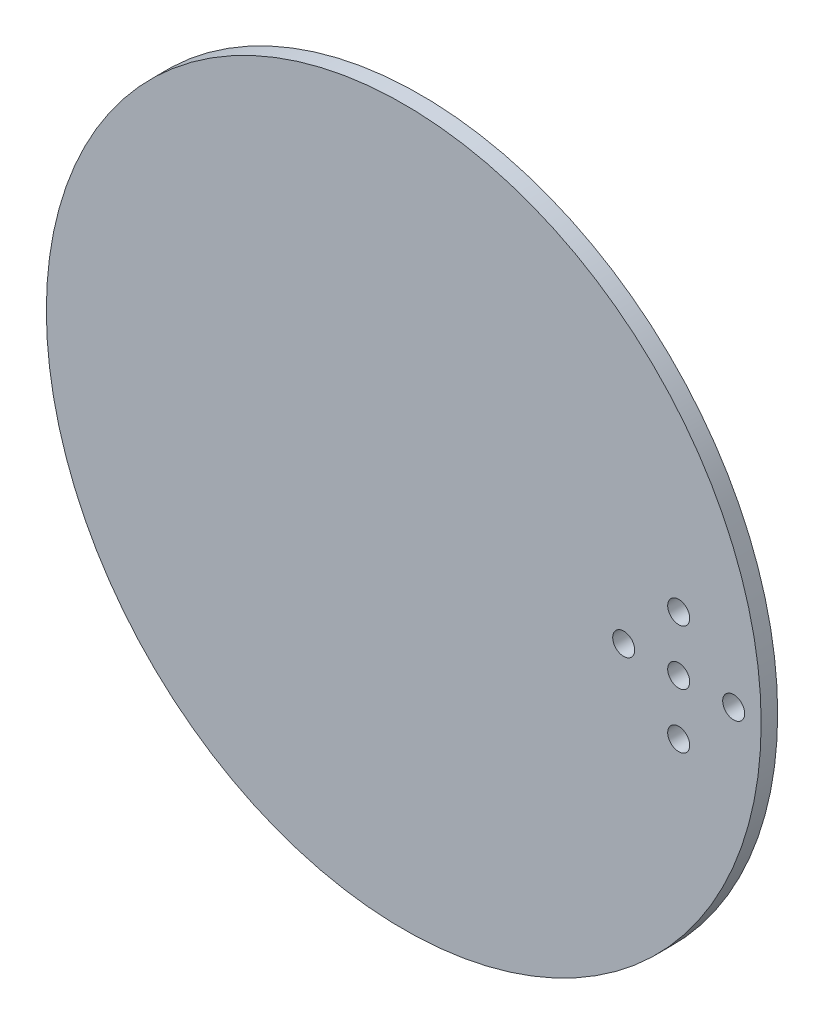
ISO-10303-21;
HEADER;
FILE_DESCRIPTION(('STEP AP214'),'2;1');
FILE_NAME('part.step','',(''),(''),'','','');
FILE_SCHEMA(('AUTOMOTIVE_DESIGN { 1 0 10303 214 1 1 1 1 }'));
ENDSEC;
DATA;
#1=APPLICATION_CONTEXT('core data for automotive mechanical design processes');
#2=APPLICATION_PROTOCOL_DEFINITION('international standard','automotive_design',2000,#1);
#3=PRODUCT_CONTEXT('',#1,'mechanical');
#4=PRODUCT('Part','Part','',(#3));
#5=PRODUCT_RELATED_PRODUCT_CATEGORY('part','',(#4));
#6=PRODUCT_DEFINITION_FORMATION('','',#4);
#7=PRODUCT_DEFINITION_CONTEXT('part definition',#1,'design');
#8=PRODUCT_DEFINITION('design','',#6,#7);
#9=PRODUCT_DEFINITION_SHAPE('','',#8);
#10=(LENGTH_UNIT() NAMED_UNIT(*) SI_UNIT(.MILLI.,.METRE.));
#11=(NAMED_UNIT(*) PLANE_ANGLE_UNIT() SI_UNIT($,.RADIAN.));
#12=(NAMED_UNIT(*) SI_UNIT($,.STERADIAN.) SOLID_ANGLE_UNIT());
#13=UNCERTAINTY_MEASURE_WITH_UNIT(LENGTH_MEASURE(1.E-05),#10,'distance_accuracy_value','');
#14=(GEOMETRIC_REPRESENTATION_CONTEXT(3) GLOBAL_UNCERTAINTY_ASSIGNED_CONTEXT((#13)) GLOBAL_UNIT_ASSIGNED_CONTEXT((#10,
#11,#12)) REPRESENTATION_CONTEXT('',''));
#15=CARTESIAN_POINT('',(0.,0.,0.));
#16=DIRECTION('',(0.,0.,1.));
#17=DIRECTION('',(1.,0.,0.));
#18=AXIS2_PLACEMENT_3D('',#15,#16,#17);
#19=CARTESIAN_POINT('',(0.,0.,3.));
#20=DIRECTION('',(0.,0.,-1.));
#21=DIRECTION('',(-1.,0.,0.));
#22=AXIS2_PLACEMENT_3D('',#19,#20,#21);
#23=CYLINDRICAL_SURFACE('',#22,65.);
#24=CARTESIAN_POINT('',(0.,0.,3.));
#25=DIRECTION('',(0.,0.,1.));
#26=DIRECTION('',(1.,0.,0.));
#27=AXIS2_PLACEMENT_3D('',#24,#25,#26);
#28=CIRCLE('',#27,65.);
#29=CARTESIAN_POINT('',(65.,0.,3.));
#30=VERTEX_POINT('',#29);
#31=EDGE_CURVE('E10',#30,#30,#28,.T.);
#32=ORIENTED_EDGE('',*,*,#31,.F.);
#33=EDGE_LOOP('',(#32));
#34=FACE_BOUND('',#33,.T.);
#35=CARTESIAN_POINT('',(0.,0.,0.));
#36=DIRECTION('',(0.,0.,1.));
#37=DIRECTION('',(1.,0.,0.));
#38=AXIS2_PLACEMENT_3D('',#35,#36,#37);
#39=CIRCLE('',#38,65.);
#40=CARTESIAN_POINT('',(65.,0.,0.));
#41=VERTEX_POINT('',#40);
#42=EDGE_CURVE('E34',#41,#41,#39,.T.);
#43=ORIENTED_EDGE('',*,*,#42,.T.);
#44=EDGE_LOOP('',(#43));
#45=FACE_BOUND('',#44,.T.);
#46=ADVANCED_FACE('F31',(#34,#45),#23,.T.);
#47=CARTESIAN_POINT('',(0.,0.,3.));
#48=DIRECTION('',(0.,0.,1.));
#49=DIRECTION('',(1.,0.,0.));
#50=AXIS2_PLACEMENT_3D('',#47,#48,#49);
#51=PLANE('',#50);
#52=CARTESIAN_POINT('',(40.,0.,3.));
#53=DIRECTION('',(0.,0.,1.));
#54=DIRECTION('',(1.,0.,0.));
#55=AXIS2_PLACEMENT_3D('',#52,#53,#54);
#56=CIRCLE('',#55,2.);
#57=CARTESIAN_POINT('',(42.,0.,3.));
#58=VERTEX_POINT('',#57);
#59=EDGE_CURVE('E56',#58,#58,#56,.T.);
#60=ORIENTED_EDGE('',*,*,#59,.F.);
#61=EDGE_LOOP('',(#60));
#62=FACE_BOUND('',#61,.T.);
#63=CARTESIAN_POINT('',(60.,0.,3.));
#64=DIRECTION('',(0.,0.,1.));
#65=DIRECTION('',(1.,0.,0.));
#66=AXIS2_PLACEMENT_3D('',#63,#64,#65);
#67=CIRCLE('',#66,2.);
#68=CARTESIAN_POINT('',(62.,0.,3.));
#69=VERTEX_POINT('',#68);
#70=EDGE_CURVE('E60',#69,#69,#67,.T.);
#71=ORIENTED_EDGE('',*,*,#70,.F.);
#72=EDGE_LOOP('',(#71));
#73=FACE_BOUND('',#72,.T.);
#74=CARTESIAN_POINT('',(50.,9.99999999999999,3.));
#75=DIRECTION('',(0.,0.,1.));
#76=DIRECTION('',(1.,0.,0.));
#77=AXIS2_PLACEMENT_3D('',#74,#75,#76);
#78=CIRCLE('',#77,2.);
#79=CARTESIAN_POINT('',(52.,9.99999999999999,3.));
#80=VERTEX_POINT('',#79);
#81=EDGE_CURVE('E47',#80,#80,#78,.T.);
#82=ORIENTED_EDGE('',*,*,#81,.F.);
#83=EDGE_LOOP('',(#82));
#84=FACE_BOUND('',#83,.T.);
#85=CARTESIAN_POINT('',(50.,0.,3.));
#86=DIRECTION('',(0.,0.,1.));
#87=DIRECTION('',(1.,0.,0.));
#88=AXIS2_PLACEMENT_3D('',#85,#86,#87);
#89=CIRCLE('',#88,2.);
#90=CARTESIAN_POINT('',(52.,0.,3.));
#91=VERTEX_POINT('',#90);
#92=EDGE_CURVE('E46',#91,#91,#89,.T.);
#93=ORIENTED_EDGE('',*,*,#92,.F.);
#94=EDGE_LOOP('',(#93));
#95=FACE_BOUND('',#94,.T.);
#96=CARTESIAN_POINT('',(50.,-10.,3.));
#97=DIRECTION('',(0.,0.,1.));
#98=DIRECTION('',(1.,0.,0.));
#99=AXIS2_PLACEMENT_3D('',#96,#97,#98);
#100=CIRCLE('',#99,2.);
#101=CARTESIAN_POINT('',(52.,-10.,3.));
#102=VERTEX_POINT('',#101);
#103=EDGE_CURVE('E53',#102,#102,#100,.T.);
#104=ORIENTED_EDGE('',*,*,#103,.F.);
#105=EDGE_LOOP('',(#104));
#106=FACE_BOUND('',#105,.T.);
#107=ORIENTED_EDGE('',*,*,#31,.T.);
#108=EDGE_LOOP('',(#107));
#109=FACE_BOUND('',#108,.T.);
#110=ADVANCED_FACE('F83',(#62,#73,#84,#95,#106,#109),#51,.T.);
#111=CARTESIAN_POINT('',(0.,0.,0.));
#112=DIRECTION('',(0.,0.,1.));
#113=DIRECTION('',(1.,0.,0.));
#114=AXIS2_PLACEMENT_3D('',#111,#112,#113);
#115=PLANE('',#114);
#116=CARTESIAN_POINT('',(40.,0.,0.));
#117=DIRECTION('',(0.,0.,1.));
#118=DIRECTION('',(1.,0.,0.));
#119=AXIS2_PLACEMENT_3D('',#116,#117,#118);
#120=CIRCLE('',#119,2.);
#121=CARTESIAN_POINT('',(42.,0.,0.));
#122=VERTEX_POINT('',#121);
#123=EDGE_CURVE('E41',#122,#122,#120,.T.);
#124=ORIENTED_EDGE('',*,*,#123,.T.);
#125=EDGE_LOOP('',(#124));
#126=FACE_BOUND('',#125,.T.);
#127=CARTESIAN_POINT('',(60.,0.,0.));
#128=DIRECTION('',(0.,0.,1.));
#129=DIRECTION('',(1.,0.,0.));
#130=AXIS2_PLACEMENT_3D('',#127,#128,#129);
#131=CIRCLE('',#130,2.);
#132=CARTESIAN_POINT('',(62.,0.,0.));
#133=VERTEX_POINT('',#132);
#134=EDGE_CURVE('E57',#133,#133,#131,.T.);
#135=ORIENTED_EDGE('',*,*,#134,.T.);
#136=EDGE_LOOP('',(#135));
#137=FACE_BOUND('',#136,.T.);
#138=CARTESIAN_POINT('',(50.,9.99999999999999,0.));
#139=DIRECTION('',(0.,0.,1.));
#140=DIRECTION('',(1.,0.,0.));
#141=AXIS2_PLACEMENT_3D('',#138,#139,#140);
#142=CIRCLE('',#141,2.);
#143=CARTESIAN_POINT('',(52.,9.99999999999999,0.));
#144=VERTEX_POINT('',#143);
#145=EDGE_CURVE('E63',#144,#144,#142,.T.);
#146=ORIENTED_EDGE('',*,*,#145,.T.);
#147=EDGE_LOOP('',(#146));
#148=FACE_BOUND('',#147,.T.);
#149=CARTESIAN_POINT('',(50.,0.,0.));
#150=DIRECTION('',(0.,0.,1.));
#151=DIRECTION('',(1.,0.,0.));
#152=AXIS2_PLACEMENT_3D('',#149,#150,#151);
#153=CIRCLE('',#152,2.);
#154=CARTESIAN_POINT('',(52.,0.,0.));
#155=VERTEX_POINT('',#154);
#156=EDGE_CURVE('E43',#155,#155,#153,.T.);
#157=ORIENTED_EDGE('',*,*,#156,.T.);
#158=EDGE_LOOP('',(#157));
#159=FACE_BOUND('',#158,.T.);
#160=CARTESIAN_POINT('',(50.,-10.,0.));
#161=DIRECTION('',(0.,0.,1.));
#162=DIRECTION('',(1.,0.,0.));
#163=AXIS2_PLACEMENT_3D('',#160,#161,#162);
#164=CIRCLE('',#163,2.);
#165=CARTESIAN_POINT('',(52.,-10.,0.));
#166=VERTEX_POINT('',#165);
#167=EDGE_CURVE('E50',#166,#166,#164,.T.);
#168=ORIENTED_EDGE('',*,*,#167,.T.);
#169=EDGE_LOOP('',(#168));
#170=FACE_BOUND('',#169,.T.);
#171=ORIENTED_EDGE('',*,*,#42,.F.);
#172=EDGE_LOOP('',(#171));
#173=FACE_BOUND('',#172,.T.);
#174=ADVANCED_FACE('F73',(#126,#137,#148,#159,#170,#173),#115,.F.);
#175=CARTESIAN_POINT('',(50.,-10.,0.));
#176=DIRECTION('',(0.,0.,1.));
#177=DIRECTION('',(1.,0.,0.));
#178=AXIS2_PLACEMENT_3D('',#175,#176,#177);
#179=CYLINDRICAL_SURFACE('',#178,2.);
#180=ORIENTED_EDGE('',*,*,#167,.F.);
#181=EDGE_LOOP('',(#180));
#182=FACE_BOUND('',#181,.T.);
#183=ORIENTED_EDGE('',*,*,#103,.T.);
#184=EDGE_LOOP('',(#183));
#185=FACE_BOUND('',#184,.T.);
#186=ADVANCED_FACE('F95',(#182,#185),#179,.F.);
#187=CARTESIAN_POINT('',(50.,0.,0.));
#188=DIRECTION('',(0.,0.,1.));
#189=DIRECTION('',(1.,0.,0.));
#190=AXIS2_PLACEMENT_3D('',#187,#188,#189);
#191=CYLINDRICAL_SURFACE('',#190,2.);
#192=ORIENTED_EDGE('',*,*,#156,.F.);
#193=EDGE_LOOP('',(#192));
#194=FACE_BOUND('',#193,.T.);
#195=ORIENTED_EDGE('',*,*,#92,.T.);
#196=EDGE_LOOP('',(#195));
#197=FACE_BOUND('',#196,.T.);
#198=ADVANCED_FACE('F97',(#194,#197),#191,.F.);
#199=CARTESIAN_POINT('',(50.,9.99999999999999,0.));
#200=DIRECTION('',(0.,0.,1.));
#201=DIRECTION('',(1.,0.,0.));
#202=AXIS2_PLACEMENT_3D('',#199,#200,#201);
#203=CYLINDRICAL_SURFACE('',#202,2.);
#204=ORIENTED_EDGE('',*,*,#145,.F.);
#205=EDGE_LOOP('',(#204));
#206=FACE_BOUND('',#205,.T.);
#207=ORIENTED_EDGE('',*,*,#81,.T.);
#208=EDGE_LOOP('',(#207));
#209=FACE_BOUND('',#208,.T.);
#210=ADVANCED_FACE('F104',(#206,#209),#203,.F.);
#211=CARTESIAN_POINT('',(60.,0.,0.));
#212=DIRECTION('',(0.,0.,1.));
#213=DIRECTION('',(1.,0.,0.));
#214=AXIS2_PLACEMENT_3D('',#211,#212,#213);
#215=CYLINDRICAL_SURFACE('',#214,2.);
#216=ORIENTED_EDGE('',*,*,#134,.F.);
#217=EDGE_LOOP('',(#216));
#218=FACE_BOUND('',#217,.T.);
#219=ORIENTED_EDGE('',*,*,#70,.T.);
#220=EDGE_LOOP('',(#219));
#221=FACE_BOUND('',#220,.T.);
#222=ADVANCED_FACE('F79',(#218,#221),#215,.F.);
#223=CARTESIAN_POINT('',(40.,0.,0.));
#224=DIRECTION('',(0.,0.,1.));
#225=DIRECTION('',(1.,0.,0.));
#226=AXIS2_PLACEMENT_3D('',#223,#224,#225);
#227=CYLINDRICAL_SURFACE('',#226,2.);
#228=ORIENTED_EDGE('',*,*,#123,.F.);
#229=EDGE_LOOP('',(#228));
#230=FACE_BOUND('',#229,.T.);
#231=ORIENTED_EDGE('',*,*,#59,.T.);
#232=EDGE_LOOP('',(#231));
#233=FACE_BOUND('',#232,.T.);
#234=ADVANCED_FACE('F76',(#230,#233),#227,.F.);
#235=CLOSED_SHELL('',(#46,#110,#174,#186,#198,#210,#222,#234));
#236=MANIFOLD_SOLID_BREP('B2',#235);
#237=ADVANCED_BREP_SHAPE_REPRESENTATION('',(#18,#236),#14);
#238=SHAPE_DEFINITION_REPRESENTATION(#9,#237);
ENDSEC;
END-ISO-10303-21;
